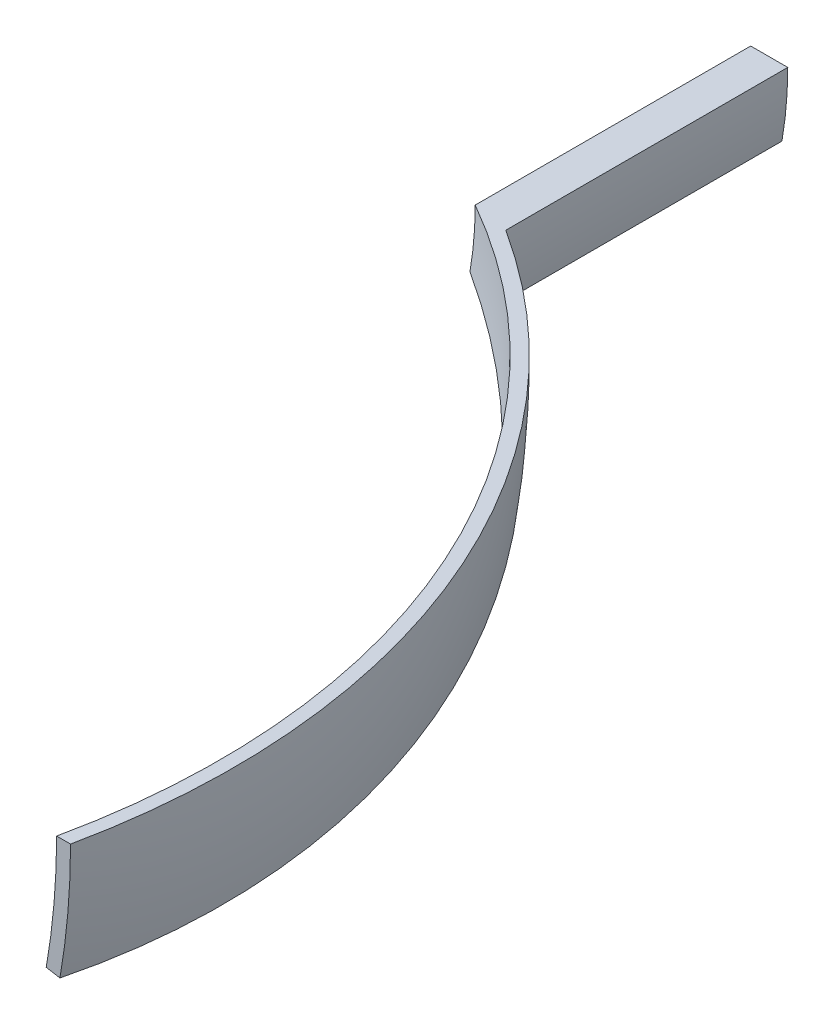
ISO-10303-21;
HEADER;
FILE_DESCRIPTION(('STEP AP214'),'2;1');
FILE_NAME('part.step','',(''),(''),'','','');
FILE_SCHEMA(('AUTOMOTIVE_DESIGN { 1 0 10303 214 1 1 1 1 }'));
ENDSEC;
DATA;
#1=APPLICATION_CONTEXT('core data for automotive mechanical design processes');
#2=APPLICATION_PROTOCOL_DEFINITION('international standard','automotive_design',2000,#1);
#3=PRODUCT_CONTEXT('',#1,'mechanical');
#4=PRODUCT('Part','Part','',(#3));
#5=PRODUCT_RELATED_PRODUCT_CATEGORY('part','',(#4));
#6=PRODUCT_DEFINITION_FORMATION('','',#4);
#7=PRODUCT_DEFINITION_CONTEXT('part definition',#1,'design');
#8=PRODUCT_DEFINITION('design','',#6,#7);
#9=PRODUCT_DEFINITION_SHAPE('','',#8);
#10=(LENGTH_UNIT() NAMED_UNIT(*) SI_UNIT(.MILLI.,.METRE.));
#11=(NAMED_UNIT(*) PLANE_ANGLE_UNIT() SI_UNIT($,.RADIAN.));
#12=(NAMED_UNIT(*) SI_UNIT($,.STERADIAN.) SOLID_ANGLE_UNIT());
#13=UNCERTAINTY_MEASURE_WITH_UNIT(LENGTH_MEASURE(1.E-05),#10,'distance_accuracy_value','');
#14=(GEOMETRIC_REPRESENTATION_CONTEXT(3) GLOBAL_UNCERTAINTY_ASSIGNED_CONTEXT((#13)) GLOBAL_UNIT_ASSIGNED_CONTEXT((#10,
#11,#12)) REPRESENTATION_CONTEXT('',''));
#15=CARTESIAN_POINT('',(0.,0.,0.));
#16=DIRECTION('',(0.,0.,1.));
#17=DIRECTION('',(1.,0.,0.));
#18=AXIS2_PLACEMENT_3D('',#15,#16,#17);
#19=CARTESIAN_POINT('',(0.,0.,125.));
#20=DIRECTION('',(0.,0.,1.));
#21=DIRECTION('',(1.,0.,0.));
#22=AXIS2_PLACEMENT_3D('',#19,#20,#21);
#23=CYLINDRICAL_SURFACE('',#22,75.);
#24=CARTESIAN_POINT('',(0.,0.,-190.7));
#25=DIRECTION('',(0.,0.,1.));
#26=DIRECTION('',(1.,0.,0.));
#27=AXIS2_PLACEMENT_3D('',#24,#25,#26);
#28=CIRCLE('',#27,75.);
#29=CARTESIAN_POINT('',(73.8605814759156,-13.0236133250198,-190.7));
#30=VERTEX_POINT('',#29);
#31=CARTESIAN_POINT('',(75.,0.,-190.7));
#32=VERTEX_POINT('',#31);
#33=EDGE_CURVE('E11',#30,#32,#28,.T.);
#34=ORIENTED_EDGE('',*,*,#33,.F.);
#35=DIRECTION('',(0.,0.,1.));
#36=VECTOR('',#35,1.);
#37=CARTESIAN_POINT('',(73.8605814759156,-13.0236133250198,-190.7));
#38=LINE('',#37,#36);
#39=CARTESIAN_POINT('',(73.8605814759156,-13.0236133250198,-131.244762333681));
#40=VERTEX_POINT('',#39);
#41=EDGE_CURVE('E88',#30,#40,#38,.T.);
#42=ORIENTED_EDGE('',*,*,#41,.T.);
#43=CARTESIAN_POINT('',(0.,0.,-131.244762333681));
#44=DIRECTION('',(0.,0.,1.));
#45=DIRECTION('',(1.,0.,0.));
#46=AXIS2_PLACEMENT_3D('',#43,#44,#45);
#47=CIRCLE('',#46,75.);
#48=CARTESIAN_POINT('',(75.,0.,-131.244762333681));
#49=VERTEX_POINT('',#48);
#50=EDGE_CURVE('E83',#40,#49,#47,.T.);
#51=ORIENTED_EDGE('',*,*,#50,.T.);
#52=DIRECTION('',(0.,0.,1.));
#53=VECTOR('',#52,1.);
#54=CARTESIAN_POINT('',(75.,0.,-190.7));
#55=LINE('',#54,#53);
#56=EDGE_CURVE('E86',#32,#49,#55,.T.);
#57=ORIENTED_EDGE('',*,*,#56,.F.);
#58=EDGE_LOOP('',(#34,#42,#51,#57));
#59=FACE_BOUND('',#58,.T.);
#60=ADVANCED_FACE('F35',(#59),#23,.F.);
#61=CARTESIAN_POINT('',(73.8605814759156,-13.0236133250198,-190.7));
#62=DIRECTION('',(0.,0.,-1.));
#63=DIRECTION('',(-1.,0.,0.));
#64=AXIS2_PLACEMENT_3D('',#61,#62,#63);
#65=PLANE('',#64);
#66=CARTESIAN_POINT('',(0.,0.,-190.7));
#67=DIRECTION('',(0.,0.,1.));
#68=DIRECTION('',(1.,0.,0.));
#69=AXIS2_PLACEMENT_3D('',#66,#67,#68);
#70=CIRCLE('',#69,83.);
#71=CARTESIAN_POINT('',(81.7390435000133,-14.4127987463552,-190.7));
#72=VERTEX_POINT('',#71);
#73=CARTESIAN_POINT('',(83.,0.,-190.7));
#74=VERTEX_POINT('',#73);
#75=EDGE_CURVE('E43',#72,#74,#70,.T.);
#76=ORIENTED_EDGE('',*,*,#75,.F.);
#77=DIRECTION('',(-0.984807753012208,0.173648177666931,0.));
#78=VECTOR('',#77,1.);
#79=CARTESIAN_POINT('',(73.8605814759156,-13.0236133250198,-190.7));
#80=LINE('',#79,#78);
#81=EDGE_CURVE('E93',#72,#30,#80,.T.);
#82=ORIENTED_EDGE('',*,*,#81,.T.);
#83=ORIENTED_EDGE('',*,*,#33,.T.);
#84=DIRECTION('',(-1.,0.,0.));
#85=VECTOR('',#84,1.);
#86=CARTESIAN_POINT('',(75.,0.,-190.7));
#87=LINE('',#86,#85);
#88=EDGE_CURVE('E106',#74,#32,#87,.T.);
#89=ORIENTED_EDGE('',*,*,#88,.F.);
#90=EDGE_LOOP('',(#76,#82,#83,#89));
#91=FACE_BOUND('',#90,.T.);
#92=ADVANCED_FACE('F37',(#91),#65,.T.);
#93=CARTESIAN_POINT('',(0.,0.,125.));
#94=DIRECTION('',(0.,0.,1.));
#95=DIRECTION('',(1.,0.,0.));
#96=AXIS2_PLACEMENT_3D('',#93,#94,#95);
#97=CYLINDRICAL_SURFACE('',#96,83.);
#98=CARTESIAN_POINT('',(0.,0.,-129.833691726161));
#99=DIRECTION('',(0.,0.,1.));
#100=DIRECTION('',(1.,0.,0.));
#101=AXIS2_PLACEMENT_3D('',#98,#99,#100);
#102=CIRCLE('',#101,83.);
#103=CARTESIAN_POINT('',(81.7390435000133,-14.4127987463552,-129.833691726161));
#104=VERTEX_POINT('',#103);
#105=CARTESIAN_POINT('',(83.,0.,-129.833691726161));
#106=VERTEX_POINT('',#105);
#107=EDGE_CURVE('E131',#104,#106,#102,.T.);
#108=ORIENTED_EDGE('',*,*,#107,.F.);
#109=DIRECTION('',(0.,0.,-1.));
#110=VECTOR('',#109,1.);
#111=CARTESIAN_POINT('',(81.7390435000133,-14.4127987463552,-190.7));
#112=LINE('',#111,#110);
#113=EDGE_CURVE('E125',#104,#72,#112,.T.);
#114=ORIENTED_EDGE('',*,*,#113,.T.);
#115=ORIENTED_EDGE('',*,*,#75,.T.);
#116=DIRECTION('',(0.,0.,-1.));
#117=VECTOR('',#116,1.);
#118=CARTESIAN_POINT('',(83.,0.,-190.7));
#119=LINE('',#118,#117);
#120=EDGE_CURVE('E113',#106,#74,#119,.T.);
#121=ORIENTED_EDGE('',*,*,#120,.F.);
#122=EDGE_LOOP('',(#108,#114,#115,#121));
#123=FACE_BOUND('',#122,.T.);
#124=ADVANCED_FACE('F134',(#123),#97,.T.);
#125=CARTESIAN_POINT('',(0.,0.,0.));
#126=DIRECTION('',(0.,0.,1.));
#127=DIRECTION('',(0.984807753012208,-0.173648177666931,0.));
#128=AXIS2_PLACEMENT_3D('',#125,#126,#127);
#129=SPHERICAL_SURFACE('',#128,154.096682336914);
#130=CARTESIAN_POINT('',(0.,0.,31.8623037841745));
#131=DIRECTION('',(0.,0.,1.));
#132=DIRECTION('',(1.,0.,0.));
#133=AXIS2_PLACEMENT_3D('',#130,#131,#132);
#134=CIRCLE('',#133,150.766644536544);
#135=CARTESIAN_POINT('',(148.476160435224,-26.1803530767288,31.8623037841745));
#136=VERTEX_POINT('',#135);
#137=CARTESIAN_POINT('',(150.766644536544,0.,31.8623037841745));
#138=VERTEX_POINT('',#137);
#139=EDGE_CURVE('E129',#136,#138,#134,.T.);
#140=ORIENTED_EDGE('',*,*,#139,.F.);
#141=CARTESIAN_POINT('',(0.,0.,0.));
#142=DIRECTION('',(0.173648177666931,0.984807753012208,0.));
#143=DIRECTION('',(0.,0.,-1.));
#144=AXIS2_PLACEMENT_3D('',#141,#142,#143);
#145=CIRCLE('',#144,154.096682336914);
#146=EDGE_CURVE('E122',#136,#104,#145,.T.);
#147=ORIENTED_EDGE('',*,*,#146,.T.);
#148=ORIENTED_EDGE('',*,*,#107,.T.);
#149=CARTESIAN_POINT('',(0.,0.,0.));
#150=DIRECTION('',(0.,1.,0.));
#151=DIRECTION('',(0.,0.,-1.));
#152=AXIS2_PLACEMENT_3D('',#149,#150,#151);
#153=CIRCLE('',#152,154.096682336914);
#154=EDGE_CURVE('E110',#138,#106,#153,.T.);
#155=ORIENTED_EDGE('',*,*,#154,.F.);
#156=EDGE_LOOP('',(#140,#147,#148,#155));
#157=FACE_BOUND('',#156,.T.);
#158=ADVANCED_FACE('F145',(#157),#129,.T.);
#159=CARTESIAN_POINT('',(145.521737176188,-25.659408543728,31.8623037841745));
#160=DIRECTION('',(0.,0.,1.));
#161=DIRECTION('',(1.,0.,0.));
#162=AXIS2_PLACEMENT_3D('',#159,#160,#161);
#163=PLANE('',#162);
#164=CARTESIAN_POINT('',(0.,0.,31.8623037841745));
#165=DIRECTION('',(0.,0.,1.));
#166=DIRECTION('',(1.,0.,0.));
#167=AXIS2_PLACEMENT_3D('',#164,#165,#166);
#168=CIRCLE('',#167,147.766644536544);
#169=CARTESIAN_POINT('',(145.521737176188,-25.659408543728,31.8623037841745));
#170=VERTEX_POINT('',#169);
#171=CARTESIAN_POINT('',(147.766644536544,0.,31.8623037841745));
#172=VERTEX_POINT('',#171);
#173=EDGE_CURVE('E92',#170,#172,#168,.T.);
#174=ORIENTED_EDGE('',*,*,#173,.F.);
#175=DIRECTION('',(0.984807753012208,-0.173648177666931,0.));
#176=VECTOR('',#175,1.);
#177=CARTESIAN_POINT('',(145.521737176188,-25.659408543728,31.8623037841745));
#178=LINE('',#177,#176);
#179=EDGE_CURVE('E119',#170,#136,#178,.T.);
#180=ORIENTED_EDGE('',*,*,#179,.T.);
#181=ORIENTED_EDGE('',*,*,#139,.T.);
#182=DIRECTION('',(1.,0.,0.));
#183=VECTOR('',#182,1.);
#184=CARTESIAN_POINT('',(147.766644536544,0.,31.8623037841745));
#185=LINE('',#184,#183);
#186=EDGE_CURVE('E101',#172,#138,#185,.T.);
#187=ORIENTED_EDGE('',*,*,#186,.F.);
#188=EDGE_LOOP('',(#174,#180,#181,#187));
#189=FACE_BOUND('',#188,.T.);
#190=ADVANCED_FACE('F143',(#189),#163,.T.);
#191=CARTESIAN_POINT('',(0.,0.,0.));
#192=DIRECTION('',(0.,0.,1.));
#193=DIRECTION('',(0.984807753012208,-0.173648177666931,0.));
#194=AXIS2_PLACEMENT_3D('',#191,#192,#193);
#195=SPHERICAL_SURFACE('',#194,151.162785235072);
#196=CARTESIAN_POINT('',(0.,0.,0.));
#197=DIRECTION('',(-0.173648177666931,-0.984807753012208,0.));
#198=DIRECTION('',(0.,0.,-1.));
#199=AXIS2_PLACEMENT_3D('',#196,#197,#198);
#200=CIRCLE('',#199,151.162785235072);
#201=EDGE_CURVE('E117',#40,#170,#200,.T.);
#202=ORIENTED_EDGE('',*,*,#201,.T.);
#203=ORIENTED_EDGE('',*,*,#173,.T.);
#204=CARTESIAN_POINT('',(0.,0.,0.));
#205=DIRECTION('',(0.,-1.,0.));
#206=DIRECTION('',(0.,0.,-1.));
#207=AXIS2_PLACEMENT_3D('',#204,#205,#206);
#208=CIRCLE('',#207,151.162785235072);
#209=EDGE_CURVE('E96',#49,#172,#208,.T.);
#210=ORIENTED_EDGE('',*,*,#209,.F.);
#211=ORIENTED_EDGE('',*,*,#50,.F.);
#212=EDGE_LOOP('',(#202,#203,#210,#211));
#213=FACE_BOUND('',#212,.T.);
#214=ADVANCED_FACE('F97',(#213),#195,.F.);
#215=CARTESIAN_POINT('',(0.,0.,0.));
#216=DIRECTION('',(-0.173648177666931,-0.984807753012208,0.));
#217=DIRECTION('',(0.,0.,-1.));
#218=AXIS2_PLACEMENT_3D('',#215,#216,#217);
#219=PLANE('',#218);
#220=ORIENTED_EDGE('',*,*,#41,.F.);
#221=ORIENTED_EDGE('',*,*,#81,.F.);
#222=ORIENTED_EDGE('',*,*,#113,.F.);
#223=ORIENTED_EDGE('',*,*,#146,.F.);
#224=ORIENTED_EDGE('',*,*,#179,.F.);
#225=ORIENTED_EDGE('',*,*,#201,.F.);
#226=EDGE_LOOP('',(#220,#221,#222,#223,#224,#225));
#227=FACE_BOUND('',#226,.T.);
#228=ADVANCED_FACE('F139',(#227),#219,.T.);
#229=CARTESIAN_POINT('',(0.,0.,0.));
#230=DIRECTION('',(0.,-1.,0.));
#231=DIRECTION('',(0.,0.,-1.));
#232=AXIS2_PLACEMENT_3D('',#229,#230,#231);
#233=PLANE('',#232);
#234=ORIENTED_EDGE('',*,*,#56,.T.);
#235=ORIENTED_EDGE('',*,*,#209,.T.);
#236=ORIENTED_EDGE('',*,*,#186,.T.);
#237=ORIENTED_EDGE('',*,*,#154,.T.);
#238=ORIENTED_EDGE('',*,*,#120,.T.);
#239=ORIENTED_EDGE('',*,*,#88,.T.);
#240=EDGE_LOOP('',(#234,#235,#236,#237,#238,#239));
#241=FACE_BOUND('',#240,.T.);
#242=ADVANCED_FACE('F104',(#241),#233,.F.);
#243=CLOSED_SHELL('',(#60,#92,#124,#158,#190,#214,#228,#242));
#244=MANIFOLD_SOLID_BREP('B2',#243);
#245=ADVANCED_BREP_SHAPE_REPRESENTATION('',(#18,#244),#14);
#246=SHAPE_DEFINITION_REPRESENTATION(#9,#245);
ENDSEC;
END-ISO-10303-21;
